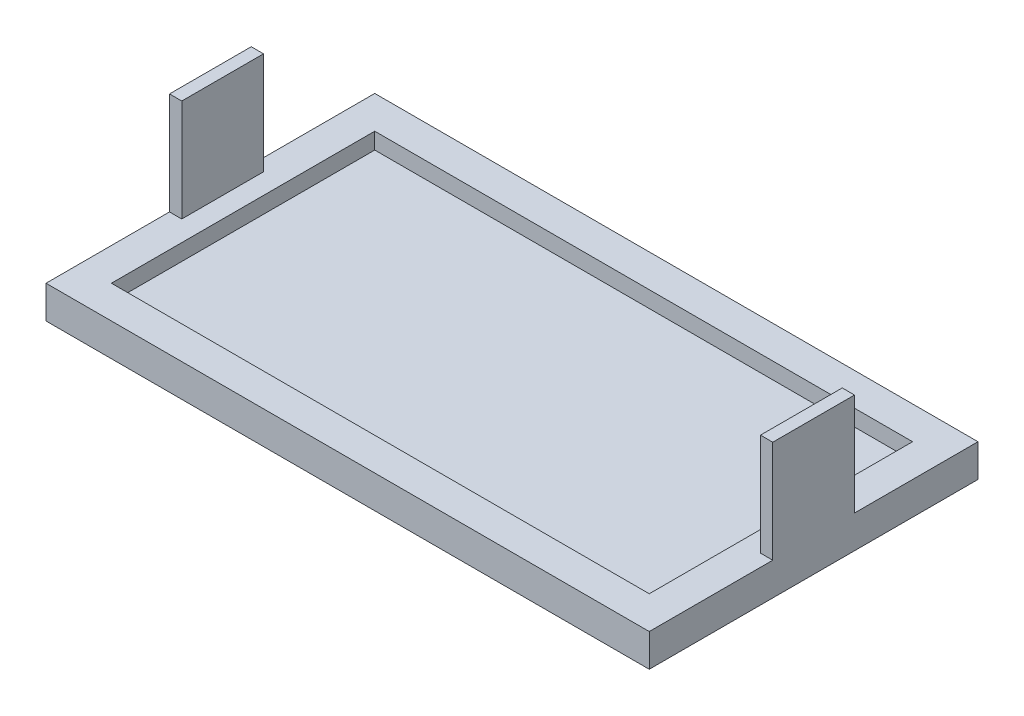
ISO-10303-21;
HEADER;
FILE_DESCRIPTION(('STEP AP214'),'2;1');
FILE_NAME('part.step','',(''),(''),'','','');
FILE_SCHEMA(('AUTOMOTIVE_DESIGN { 1 0 10303 214 1 1 1 1 }'));
ENDSEC;
DATA;
#1=APPLICATION_CONTEXT('core data for automotive mechanical design processes');
#2=APPLICATION_PROTOCOL_DEFINITION('international standard','automotive_design',2000,#1);
#3=PRODUCT_CONTEXT('',#1,'mechanical');
#4=PRODUCT('Part','Part','',(#3));
#5=PRODUCT_RELATED_PRODUCT_CATEGORY('part','',(#4));
#6=PRODUCT_DEFINITION_FORMATION('','',#4);
#7=PRODUCT_DEFINITION_CONTEXT('part definition',#1,'design');
#8=PRODUCT_DEFINITION('design','',#6,#7);
#9=PRODUCT_DEFINITION_SHAPE('','',#8);
#10=(LENGTH_UNIT() NAMED_UNIT(*) SI_UNIT(.MILLI.,.METRE.));
#11=(NAMED_UNIT(*) PLANE_ANGLE_UNIT() SI_UNIT($,.RADIAN.));
#12=(NAMED_UNIT(*) SI_UNIT($,.STERADIAN.) SOLID_ANGLE_UNIT());
#13=UNCERTAINTY_MEASURE_WITH_UNIT(LENGTH_MEASURE(1.E-05),#10,'distance_accuracy_value','');
#14=(GEOMETRIC_REPRESENTATION_CONTEXT(3) GLOBAL_UNCERTAINTY_ASSIGNED_CONTEXT((#13)) GLOBAL_UNIT_ASSIGNED_CONTEXT((#10,
#11,#12)) REPRESENTATION_CONTEXT('',''));
#15=CARTESIAN_POINT('',(0.,0.,0.));
#16=DIRECTION('',(0.,0.,1.));
#17=DIRECTION('',(1.,0.,0.));
#18=AXIS2_PLACEMENT_3D('',#15,#16,#17);
#19=CARTESIAN_POINT('',(0.,8.,0.));
#20=DIRECTION('',(0.,-1.,0.));
#21=DIRECTION('',(0.,0.,-1.));
#22=AXIS2_PLACEMENT_3D('',#19,#20,#21);
#23=PLANE('',#22);
#24=DIRECTION('',(1.,0.,0.));
#25=VECTOR('',#24,1.);
#26=CARTESIAN_POINT('',(8.00000000000001,8.,-8.));
#27=LINE('',#26,#25);
#28=CARTESIAN_POINT('',(8.00000000000001,8.,-8.));
#29=VERTEX_POINT('',#28);
#30=CARTESIAN_POINT('',(139.57,8.,-8.));
#31=VERTEX_POINT('',#30);
#32=EDGE_CURVE('E262',#29,#31,#27,.T.);
#33=ORIENTED_EDGE('',*,*,#32,.F.);
#34=DIRECTION('',(0.,0.,1.));
#35=VECTOR('',#34,1.);
#36=CARTESIAN_POINT('',(8.,8.,-72.42));
#37=LINE('',#36,#35);
#38=CARTESIAN_POINT('',(8.,8.,-72.42));
#39=VERTEX_POINT('',#38);
#40=EDGE_CURVE('E241',#39,#29,#37,.T.);
#41=ORIENTED_EDGE('',*,*,#40,.F.);
#42=DIRECTION('',(-1.,0.,0.));
#43=VECTOR('',#42,1.);
#44=CARTESIAN_POINT('',(8.,8.,-72.42));
#45=LINE('',#44,#43);
#46=CARTESIAN_POINT('',(139.57,8.,-72.42));
#47=VERTEX_POINT('',#46);
#48=EDGE_CURVE('E247',#47,#39,#45,.T.);
#49=ORIENTED_EDGE('',*,*,#48,.F.);
#50=DIRECTION('',(0.,0.,-1.));
#51=VECTOR('',#50,1.);
#52=CARTESIAN_POINT('',(139.57,8.,-72.42));
#53=LINE('',#52,#51);
#54=EDGE_CURVE('E266',#31,#47,#53,.T.);
#55=ORIENTED_EDGE('',*,*,#54,.F.);
#56=EDGE_LOOP('',(#33,#41,#49,#55));
#57=FACE_BOUND('',#56,.T.);
#58=DIRECTION('',(0.,0.,-1.));
#59=VECTOR('',#58,1.);
#60=CARTESIAN_POINT('',(144.57,8.,-50.21));
#61=LINE('',#60,#59);
#62=CARTESIAN_POINT('',(144.57,8.,-30.21));
#63=VERTEX_POINT('',#62);
#64=CARTESIAN_POINT('',(144.57,8.,-50.21));
#65=VERTEX_POINT('',#64);
#66=EDGE_CURVE('E54',#63,#65,#61,.T.);
#67=ORIENTED_EDGE('',*,*,#66,.T.);
#68=DIRECTION('',(1.,0.,0.));
#69=VECTOR('',#68,1.);
#70=CARTESIAN_POINT('',(147.57,8.,-50.21));
#71=LINE('',#70,#69);
#72=CARTESIAN_POINT('',(147.57,8.,-50.21));
#73=VERTEX_POINT('',#72);
#74=EDGE_CURVE('E187',#65,#73,#71,.T.);
#75=ORIENTED_EDGE('',*,*,#74,.T.);
#76=DIRECTION('',(0.,0.,-1.));
#77=VECTOR('',#76,1.);
#78=CARTESIAN_POINT('',(147.57,8.,0.));
#79=LINE('',#78,#77);
#80=CARTESIAN_POINT('',(147.57,8.,-80.42));
#81=VERTEX_POINT('',#80);
#82=EDGE_CURVE('E159',#73,#81,#79,.T.);
#83=ORIENTED_EDGE('',*,*,#82,.T.);
#84=DIRECTION('',(-1.,0.,0.));
#85=VECTOR('',#84,1.);
#86=CARTESIAN_POINT('',(0.,8.,-80.42));
#87=LINE('',#86,#85);
#88=CARTESIAN_POINT('',(0.,8.,-80.42));
#89=VERTEX_POINT('',#88);
#90=EDGE_CURVE('E296',#81,#89,#87,.T.);
#91=ORIENTED_EDGE('',*,*,#90,.T.);
#92=DIRECTION('',(0.,0.,1.));
#93=VECTOR('',#92,1.);
#94=CARTESIAN_POINT('',(0.,8.,0.));
#95=LINE('',#94,#93);
#96=CARTESIAN_POINT('',(0.,8.,-50.21));
#97=VERTEX_POINT('',#96);
#98=EDGE_CURVE('E286',#89,#97,#95,.T.);
#99=ORIENTED_EDGE('',*,*,#98,.T.);
#100=DIRECTION('',(-1.,0.,0.));
#101=VECTOR('',#100,1.);
#102=CARTESIAN_POINT('',(0.,8.,-50.21));
#103=LINE('',#102,#101);
#104=CARTESIAN_POINT('',(3.,8.,-50.21));
#105=VERTEX_POINT('',#104);
#106=EDGE_CURVE('E206',#105,#97,#103,.T.);
#107=ORIENTED_EDGE('',*,*,#106,.F.);
#108=DIRECTION('',(0.,0.,-1.));
#109=VECTOR('',#108,1.);
#110=CARTESIAN_POINT('',(3.,8.,-50.21));
#111=LINE('',#110,#109);
#112=CARTESIAN_POINT('',(3.,8.,-30.21));
#113=VERTEX_POINT('',#112);
#114=EDGE_CURVE('E219',#113,#105,#111,.T.);
#115=ORIENTED_EDGE('',*,*,#114,.F.);
#116=DIRECTION('',(1.,0.,0.));
#117=VECTOR('',#116,1.);
#118=CARTESIAN_POINT('',(0.,8.,-30.21));
#119=LINE('',#118,#117);
#120=CARTESIAN_POINT('',(0.,8.,-30.21));
#121=VERTEX_POINT('',#120);
#122=EDGE_CURVE('E164',#121,#113,#119,.T.);
#123=ORIENTED_EDGE('',*,*,#122,.F.);
#124=CARTESIAN_POINT('',(0.,8.,0.));
#125=VERTEX_POINT('',#124);
#126=EDGE_CURVE('E290',#121,#125,#95,.T.);
#127=ORIENTED_EDGE('',*,*,#126,.T.);
#128=DIRECTION('',(1.,0.,0.));
#129=VECTOR('',#128,1.);
#130=CARTESIAN_POINT('',(0.,8.,0.));
#131=LINE('',#130,#129);
#132=CARTESIAN_POINT('',(147.57,8.,0.));
#133=VERTEX_POINT('',#132);
#134=EDGE_CURVE('E289',#125,#133,#131,.T.);
#135=ORIENTED_EDGE('',*,*,#134,.T.);
#136=CARTESIAN_POINT('',(147.57,8.,-30.21));
#137=VERTEX_POINT('',#136);
#138=EDGE_CURVE('E293',#133,#137,#79,.T.);
#139=ORIENTED_EDGE('',*,*,#138,.T.);
#140=DIRECTION('',(-1.,0.,0.));
#141=VECTOR('',#140,1.);
#142=CARTESIAN_POINT('',(147.57,8.,-30.21));
#143=LINE('',#142,#141);
#144=EDGE_CURVE('E59',#137,#63,#143,.T.);
#145=ORIENTED_EDGE('',*,*,#144,.T.);
#146=EDGE_LOOP('',(#67,#75,#83,#91,#99,#107,#115,#123,#127,#135,#139,#145));
#147=FACE_BOUND('',#146,.T.);
#148=ADVANCED_FACE('F38',(#57,#147),#23,.F.);
#149=CARTESIAN_POINT('',(0.,8.,0.));
#150=DIRECTION('',(1.,0.,0.));
#151=DIRECTION('',(0.,0.,-1.));
#152=AXIS2_PLACEMENT_3D('',#149,#150,#151);
#153=PLANE('',#152);
#154=DIRECTION('',(0.,0.,1.));
#155=VECTOR('',#154,1.);
#156=CARTESIAN_POINT('',(0.,0.,0.));
#157=LINE('',#156,#155);
#158=CARTESIAN_POINT('',(0.,0.,-80.42));
#159=VERTEX_POINT('',#158);
#160=CARTESIAN_POINT('',(0.,0.,0.));
#161=VERTEX_POINT('',#160);
#162=EDGE_CURVE('E276',#159,#161,#157,.T.);
#163=ORIENTED_EDGE('',*,*,#162,.T.);
#164=DIRECTION('',(0.,-1.,0.));
#165=VECTOR('',#164,1.);
#166=CARTESIAN_POINT('',(0.,8.,0.));
#167=LINE('',#166,#165);
#168=EDGE_CURVE('E11',#125,#161,#167,.T.);
#169=ORIENTED_EDGE('',*,*,#168,.F.);
#170=ORIENTED_EDGE('',*,*,#126,.F.);
#171=DIRECTION('',(0.,-1.,0.));
#172=VECTOR('',#171,1.);
#173=CARTESIAN_POINT('',(0.,33.,-30.21));
#174=LINE('',#173,#172);
#175=CARTESIAN_POINT('',(0.,33.,-30.21));
#176=VERTEX_POINT('',#175);
#177=EDGE_CURVE('E237',#176,#121,#174,.T.);
#178=ORIENTED_EDGE('',*,*,#177,.F.);
#179=DIRECTION('',(0.,0.,1.));
#180=VECTOR('',#179,1.);
#181=CARTESIAN_POINT('',(0.,33.,-50.21));
#182=LINE('',#181,#180);
#183=CARTESIAN_POINT('',(0.,33.,-50.21));
#184=VERTEX_POINT('',#183);
#185=EDGE_CURVE('E201',#184,#176,#182,.T.);
#186=ORIENTED_EDGE('',*,*,#185,.F.);
#187=DIRECTION('',(0.,-1.,0.));
#188=VECTOR('',#187,1.);
#189=CARTESIAN_POINT('',(0.,33.,-50.21));
#190=LINE('',#189,#188);
#191=EDGE_CURVE('E215',#184,#97,#190,.T.);
#192=ORIENTED_EDGE('',*,*,#191,.T.);
#193=ORIENTED_EDGE('',*,*,#98,.F.);
#194=DIRECTION('',(0.,-1.,0.));
#195=VECTOR('',#194,1.);
#196=CARTESIAN_POINT('',(0.,8.,-80.42));
#197=LINE('',#196,#195);
#198=EDGE_CURVE('E299',#89,#159,#197,.T.);
#199=ORIENTED_EDGE('',*,*,#198,.T.);
#200=EDGE_LOOP('',(#163,#169,#170,#178,#186,#192,#193,#199));
#201=FACE_BOUND('',#200,.T.);
#202=ADVANCED_FACE('F40',(#201),#153,.F.);
#203=CARTESIAN_POINT('',(0.,8.,0.));
#204=DIRECTION('',(0.,0.,-1.));
#205=DIRECTION('',(-1.,0.,0.));
#206=AXIS2_PLACEMENT_3D('',#203,#204,#205);
#207=PLANE('',#206);
#208=DIRECTION('',(1.,0.,0.));
#209=VECTOR('',#208,1.);
#210=CARTESIAN_POINT('',(0.,0.,0.));
#211=LINE('',#210,#209);
#212=CARTESIAN_POINT('',(147.57,0.,0.));
#213=VERTEX_POINT('',#212);
#214=EDGE_CURVE('E303',#161,#213,#211,.T.);
#215=ORIENTED_EDGE('',*,*,#214,.T.);
#216=DIRECTION('',(0.,-1.,0.));
#217=VECTOR('',#216,1.);
#218=CARTESIAN_POINT('',(147.57,8.,0.));
#219=LINE('',#218,#217);
#220=EDGE_CURVE('E47',#133,#213,#219,.T.);
#221=ORIENTED_EDGE('',*,*,#220,.F.);
#222=ORIENTED_EDGE('',*,*,#134,.F.);
#223=ORIENTED_EDGE('',*,*,#168,.T.);
#224=EDGE_LOOP('',(#215,#221,#222,#223));
#225=FACE_BOUND('',#224,.T.);
#226=ADVANCED_FACE('F352',(#225),#207,.F.);
#227=CARTESIAN_POINT('',(147.57,8.,0.));
#228=DIRECTION('',(-1.,0.,0.));
#229=DIRECTION('',(0.,0.,1.));
#230=AXIS2_PLACEMENT_3D('',#227,#228,#229);
#231=PLANE('',#230);
#232=DIRECTION('',(0.,0.,-1.));
#233=VECTOR('',#232,1.);
#234=CARTESIAN_POINT('',(147.57,0.,0.));
#235=LINE('',#234,#233);
#236=CARTESIAN_POINT('',(147.57,0.,-80.42));
#237=VERTEX_POINT('',#236);
#238=EDGE_CURVE('E306',#213,#237,#235,.T.);
#239=ORIENTED_EDGE('',*,*,#238,.T.);
#240=DIRECTION('',(0.,-1.,0.));
#241=VECTOR('',#240,1.);
#242=CARTESIAN_POINT('',(147.57,8.,-80.42));
#243=LINE('',#242,#241);
#244=EDGE_CURVE('E315',#81,#237,#243,.T.);
#245=ORIENTED_EDGE('',*,*,#244,.F.);
#246=ORIENTED_EDGE('',*,*,#82,.F.);
#247=DIRECTION('',(0.,-1.,0.));
#248=VECTOR('',#247,1.);
#249=CARTESIAN_POINT('',(147.57,33.,-50.21));
#250=LINE('',#249,#248);
#251=CARTESIAN_POINT('',(147.57,33.,-50.21));
#252=VERTEX_POINT('',#251);
#253=EDGE_CURVE('E152',#252,#73,#250,.T.);
#254=ORIENTED_EDGE('',*,*,#253,.F.);
#255=DIRECTION('',(0.,0.,1.));
#256=VECTOR('',#255,1.);
#257=CARTESIAN_POINT('',(147.57,33.,-50.21));
#258=LINE('',#257,#256);
#259=CARTESIAN_POINT('',(147.57,33.,-30.21));
#260=VERTEX_POINT('',#259);
#261=EDGE_CURVE('E156',#252,#260,#258,.T.);
#262=ORIENTED_EDGE('',*,*,#261,.T.);
#263=DIRECTION('',(0.,-1.,0.));
#264=VECTOR('',#263,1.);
#265=CARTESIAN_POINT('',(147.57,33.,-30.21));
#266=LINE('',#265,#264);
#267=EDGE_CURVE('E186',#260,#137,#266,.T.);
#268=ORIENTED_EDGE('',*,*,#267,.T.);
#269=ORIENTED_EDGE('',*,*,#138,.F.);
#270=ORIENTED_EDGE('',*,*,#220,.T.);
#271=EDGE_LOOP('',(#239,#245,#246,#254,#262,#268,#269,#270));
#272=FACE_BOUND('',#271,.T.);
#273=ADVANCED_FACE('F154',(#272),#231,.F.);
#274=CARTESIAN_POINT('',(0.,8.,-80.42));
#275=DIRECTION('',(0.,0.,1.));
#276=DIRECTION('',(1.,0.,0.));
#277=AXIS2_PLACEMENT_3D('',#274,#275,#276);
#278=PLANE('',#277);
#279=DIRECTION('',(-1.,0.,0.));
#280=VECTOR('',#279,1.);
#281=CARTESIAN_POINT('',(0.,0.,-80.42));
#282=LINE('',#281,#280);
#283=EDGE_CURVE('E309',#237,#159,#282,.T.);
#284=ORIENTED_EDGE('',*,*,#283,.T.);
#285=ORIENTED_EDGE('',*,*,#198,.F.);
#286=ORIENTED_EDGE('',*,*,#90,.F.);
#287=ORIENTED_EDGE('',*,*,#244,.T.);
#288=EDGE_LOOP('',(#284,#285,#286,#287));
#289=FACE_BOUND('',#288,.T.);
#290=ADVANCED_FACE('F331',(#289),#278,.F.);
#291=CARTESIAN_POINT('',(0.,0.,0.));
#292=DIRECTION('',(0.,-1.,0.));
#293=DIRECTION('',(0.,0.,-1.));
#294=AXIS2_PLACEMENT_3D('',#291,#292,#293);
#295=PLANE('',#294);
#296=ORIENTED_EDGE('',*,*,#162,.F.);
#297=ORIENTED_EDGE('',*,*,#283,.F.);
#298=ORIENTED_EDGE('',*,*,#238,.F.);
#299=ORIENTED_EDGE('',*,*,#214,.F.);
#300=EDGE_LOOP('',(#296,#297,#298,#299));
#301=FACE_BOUND('',#300,.T.);
#302=ADVANCED_FACE('F328',(#301),#295,.T.);
#303=CARTESIAN_POINT('',(8.,4.,-72.42));
#304=DIRECTION('',(-1.,0.,0.));
#305=DIRECTION('',(0.,0.,1.));
#306=AXIS2_PLACEMENT_3D('',#303,#304,#305);
#307=PLANE('',#306);
#308=ORIENTED_EDGE('',*,*,#40,.T.);
#309=DIRECTION('',(0.,1.,0.));
#310=VECTOR('',#309,1.);
#311=CARTESIAN_POINT('',(8.00000000000001,4.,-8.));
#312=LINE('',#311,#310);
#313=CARTESIAN_POINT('',(8.00000000000001,4.,-8.));
#314=VERTEX_POINT('',#313);
#315=EDGE_CURVE('E259',#314,#29,#312,.T.);
#316=ORIENTED_EDGE('',*,*,#315,.F.);
#317=DIRECTION('',(0.,0.,1.));
#318=VECTOR('',#317,1.);
#319=CARTESIAN_POINT('',(8.,4.,-72.42));
#320=LINE('',#319,#318);
#321=CARTESIAN_POINT('',(8.,4.,-72.42));
#322=VERTEX_POINT('',#321);
#323=EDGE_CURVE('E242',#322,#314,#320,.T.);
#324=ORIENTED_EDGE('',*,*,#323,.F.);
#325=DIRECTION('',(0.,1.,0.));
#326=VECTOR('',#325,1.);
#327=CARTESIAN_POINT('',(8.,4.,-72.42));
#328=LINE('',#327,#326);
#329=EDGE_CURVE('E273',#322,#39,#328,.T.);
#330=ORIENTED_EDGE('',*,*,#329,.T.);
#331=EDGE_LOOP('',(#308,#316,#324,#330));
#332=FACE_BOUND('',#331,.T.);
#333=ADVANCED_FACE('F370',(#332),#307,.F.);
#334=CARTESIAN_POINT('',(8.,4.,-72.42));
#335=DIRECTION('',(0.,0.,-1.));
#336=DIRECTION('',(-1.,0.,0.));
#337=AXIS2_PLACEMENT_3D('',#334,#335,#336);
#338=PLANE('',#337);
#339=ORIENTED_EDGE('',*,*,#48,.T.);
#340=ORIENTED_EDGE('',*,*,#329,.F.);
#341=DIRECTION('',(-1.,0.,0.));
#342=VECTOR('',#341,1.);
#343=CARTESIAN_POINT('',(8.,4.,-72.42));
#344=LINE('',#343,#342);
#345=CARTESIAN_POINT('',(139.57,4.,-72.42));
#346=VERTEX_POINT('',#345);
#347=EDGE_CURVE('E255',#346,#322,#344,.T.);
#348=ORIENTED_EDGE('',*,*,#347,.F.);
#349=DIRECTION('',(0.,1.,0.));
#350=VECTOR('',#349,1.);
#351=CARTESIAN_POINT('',(139.57,4.,-72.42));
#352=LINE('',#351,#350);
#353=EDGE_CURVE('E277',#346,#47,#352,.T.);
#354=ORIENTED_EDGE('',*,*,#353,.T.);
#355=EDGE_LOOP('',(#339,#340,#348,#354));
#356=FACE_BOUND('',#355,.T.);
#357=ADVANCED_FACE('F386',(#356),#338,.F.);
#358=CARTESIAN_POINT('',(139.57,4.,-72.42));
#359=DIRECTION('',(1.,0.,0.));
#360=DIRECTION('',(0.,0.,-1.));
#361=AXIS2_PLACEMENT_3D('',#358,#359,#360);
#362=PLANE('',#361);
#363=ORIENTED_EDGE('',*,*,#54,.T.);
#364=ORIENTED_EDGE('',*,*,#353,.F.);
#365=DIRECTION('',(0.,0.,-1.));
#366=VECTOR('',#365,1.);
#367=CARTESIAN_POINT('',(139.57,4.,-72.42));
#368=LINE('',#367,#366);
#369=CARTESIAN_POINT('',(139.57,4.,-8.));
#370=VERTEX_POINT('',#369);
#371=EDGE_CURVE('E251',#370,#346,#368,.T.);
#372=ORIENTED_EDGE('',*,*,#371,.F.);
#373=DIRECTION('',(0.,1.,0.));
#374=VECTOR('',#373,1.);
#375=CARTESIAN_POINT('',(139.57,4.,-8.));
#376=LINE('',#375,#374);
#377=EDGE_CURVE('E280',#370,#31,#376,.T.);
#378=ORIENTED_EDGE('',*,*,#377,.T.);
#379=EDGE_LOOP('',(#363,#364,#372,#378));
#380=FACE_BOUND('',#379,.T.);
#381=ADVANCED_FACE('F393',(#380),#362,.F.);
#382=CARTESIAN_POINT('',(8.00000000000001,4.,-8.));
#383=DIRECTION('',(0.,0.,1.));
#384=DIRECTION('',(1.,0.,0.));
#385=AXIS2_PLACEMENT_3D('',#382,#383,#384);
#386=PLANE('',#385);
#387=ORIENTED_EDGE('',*,*,#32,.T.);
#388=ORIENTED_EDGE('',*,*,#377,.F.);
#389=DIRECTION('',(1.,0.,0.));
#390=VECTOR('',#389,1.);
#391=CARTESIAN_POINT('',(8.00000000000001,4.,-8.));
#392=LINE('',#391,#390);
#393=EDGE_CURVE('E246',#314,#370,#392,.T.);
#394=ORIENTED_EDGE('',*,*,#393,.F.);
#395=ORIENTED_EDGE('',*,*,#315,.T.);
#396=EDGE_LOOP('',(#387,#388,#394,#395));
#397=FACE_BOUND('',#396,.T.);
#398=ADVANCED_FACE('F401',(#397),#386,.F.);
#399=CARTESIAN_POINT('',(0.,4.,0.));
#400=DIRECTION('',(0.,1.,0.));
#401=DIRECTION('',(0.,0.,1.));
#402=AXIS2_PLACEMENT_3D('',#399,#400,#401);
#403=PLANE('',#402);
#404=ORIENTED_EDGE('',*,*,#323,.T.);
#405=ORIENTED_EDGE('',*,*,#393,.T.);
#406=ORIENTED_EDGE('',*,*,#371,.T.);
#407=ORIENTED_EDGE('',*,*,#347,.T.);
#408=EDGE_LOOP('',(#404,#405,#406,#407));
#409=FACE_BOUND('',#408,.T.);
#410=ADVANCED_FACE('F409',(#409),#403,.T.);
#411=CARTESIAN_POINT('',(0.,33.,-30.21));
#412=DIRECTION('',(0.,0.,-1.));
#413=DIRECTION('',(-1.,0.,0.));
#414=AXIS2_PLACEMENT_3D('',#411,#412,#413);
#415=PLANE('',#414);
#416=ORIENTED_EDGE('',*,*,#122,.T.);
#417=DIRECTION('',(0.,-1.,0.));
#418=VECTOR('',#417,1.);
#419=CARTESIAN_POINT('',(3.,33.,-30.21));
#420=LINE('',#419,#418);
#421=CARTESIAN_POINT('',(3.,33.,-30.21));
#422=VERTEX_POINT('',#421);
#423=EDGE_CURVE('E233',#422,#113,#420,.T.);
#424=ORIENTED_EDGE('',*,*,#423,.F.);
#425=DIRECTION('',(1.,0.,0.));
#426=VECTOR('',#425,1.);
#427=CARTESIAN_POINT('',(0.,33.,-30.21));
#428=LINE('',#427,#426);
#429=EDGE_CURVE('E205',#176,#422,#428,.T.);
#430=ORIENTED_EDGE('',*,*,#429,.F.);
#431=ORIENTED_EDGE('',*,*,#177,.T.);
#432=EDGE_LOOP('',(#416,#424,#430,#431));
#433=FACE_BOUND('',#432,.T.);
#434=ADVANCED_FACE('F348',(#433),#415,.F.);
#435=CARTESIAN_POINT('',(3.,33.,-50.21));
#436=DIRECTION('',(-1.,0.,0.));
#437=DIRECTION('',(0.,0.,1.));
#438=AXIS2_PLACEMENT_3D('',#435,#436,#437);
#439=PLANE('',#438);
#440=ORIENTED_EDGE('',*,*,#114,.T.);
#441=DIRECTION('',(0.,-1.,0.));
#442=VECTOR('',#441,1.);
#443=CARTESIAN_POINT('',(3.,33.,-50.21));
#444=LINE('',#443,#442);
#445=CARTESIAN_POINT('',(3.,33.,-50.21));
#446=VERTEX_POINT('',#445);
#447=EDGE_CURVE('E229',#446,#105,#444,.T.);
#448=ORIENTED_EDGE('',*,*,#447,.F.);
#449=DIRECTION('',(0.,0.,-1.));
#450=VECTOR('',#449,1.);
#451=CARTESIAN_POINT('',(3.,33.,-50.21));
#452=LINE('',#451,#450);
#453=EDGE_CURVE('E209',#422,#446,#452,.T.);
#454=ORIENTED_EDGE('',*,*,#453,.F.);
#455=ORIENTED_EDGE('',*,*,#423,.T.);
#456=EDGE_LOOP('',(#440,#448,#454,#455));
#457=FACE_BOUND('',#456,.T.);
#458=ADVANCED_FACE('F344',(#457),#439,.F.);
#459=CARTESIAN_POINT('',(0.,33.,-50.21));
#460=DIRECTION('',(0.,0.,1.));
#461=DIRECTION('',(1.,0.,0.));
#462=AXIS2_PLACEMENT_3D('',#459,#460,#461);
#463=PLANE('',#462);
#464=ORIENTED_EDGE('',*,*,#106,.T.);
#465=ORIENTED_EDGE('',*,*,#191,.F.);
#466=DIRECTION('',(-1.,0.,0.));
#467=VECTOR('',#466,1.);
#468=CARTESIAN_POINT('',(0.,33.,-50.21));
#469=LINE('',#468,#467);
#470=EDGE_CURVE('E212',#446,#184,#469,.T.);
#471=ORIENTED_EDGE('',*,*,#470,.F.);
#472=ORIENTED_EDGE('',*,*,#447,.T.);
#473=EDGE_LOOP('',(#464,#465,#471,#472));
#474=FACE_BOUND('',#473,.T.);
#475=ADVANCED_FACE('F339',(#474),#463,.F.);
#476=CARTESIAN_POINT('',(0.,33.,0.));
#477=DIRECTION('',(0.,1.,0.));
#478=DIRECTION('',(0.,0.,1.));
#479=AXIS2_PLACEMENT_3D('',#476,#477,#478);
#480=PLANE('',#479);
#481=ORIENTED_EDGE('',*,*,#185,.T.);
#482=ORIENTED_EDGE('',*,*,#429,.T.);
#483=ORIENTED_EDGE('',*,*,#453,.T.);
#484=ORIENTED_EDGE('',*,*,#470,.T.);
#485=EDGE_LOOP('',(#481,#482,#483,#484));
#486=FACE_BOUND('',#485,.T.);
#487=ADVANCED_FACE('F447',(#486),#480,.T.);
#488=CARTESIAN_POINT('',(147.57,33.,-50.21));
#489=DIRECTION('',(0.,0.,-1.));
#490=DIRECTION('',(-1.,0.,0.));
#491=AXIS2_PLACEMENT_3D('',#488,#489,#490);
#492=PLANE('',#491);
#493=ORIENTED_EDGE('',*,*,#74,.F.);
#494=DIRECTION('',(0.,-1.,0.));
#495=VECTOR('',#494,1.);
#496=CARTESIAN_POINT('',(144.57,33.,-50.21));
#497=LINE('',#496,#495);
#498=CARTESIAN_POINT('',(144.57,33.,-50.21));
#499=VERTEX_POINT('',#498);
#500=EDGE_CURVE('E165',#499,#65,#497,.T.);
#501=ORIENTED_EDGE('',*,*,#500,.F.);
#502=DIRECTION('',(1.,0.,0.));
#503=VECTOR('',#502,1.);
#504=CARTESIAN_POINT('',(147.57,33.,-50.21));
#505=LINE('',#504,#503);
#506=EDGE_CURVE('E171',#499,#252,#505,.T.);
#507=ORIENTED_EDGE('',*,*,#506,.T.);
#508=ORIENTED_EDGE('',*,*,#253,.T.);
#509=EDGE_LOOP('',(#493,#501,#507,#508));
#510=FACE_BOUND('',#509,.T.);
#511=ADVANCED_FACE('F177',(#510),#492,.T.);
#512=CARTESIAN_POINT('',(144.57,33.,-50.21));
#513=DIRECTION('',(-1.,0.,0.));
#514=DIRECTION('',(0.,0.,1.));
#515=AXIS2_PLACEMENT_3D('',#512,#513,#514);
#516=PLANE('',#515);
#517=ORIENTED_EDGE('',*,*,#66,.F.);
#518=DIRECTION('',(0.,-1.,0.));
#519=VECTOR('',#518,1.);
#520=CARTESIAN_POINT('',(144.57,33.,-30.21));
#521=LINE('',#520,#519);
#522=CARTESIAN_POINT('',(144.57,33.,-30.21));
#523=VERTEX_POINT('',#522);
#524=EDGE_CURVE('E196',#523,#63,#521,.T.);
#525=ORIENTED_EDGE('',*,*,#524,.F.);
#526=DIRECTION('',(0.,0.,-1.));
#527=VECTOR('',#526,1.);
#528=CARTESIAN_POINT('',(144.57,33.,-50.21));
#529=LINE('',#528,#527);
#530=EDGE_CURVE('E179',#523,#499,#529,.T.);
#531=ORIENTED_EDGE('',*,*,#530,.T.);
#532=ORIENTED_EDGE('',*,*,#500,.T.);
#533=EDGE_LOOP('',(#517,#525,#531,#532));
#534=FACE_BOUND('',#533,.T.);
#535=ADVANCED_FACE('F459',(#534),#516,.T.);
#536=CARTESIAN_POINT('',(147.57,33.,-30.21));
#537=DIRECTION('',(0.,0.,1.));
#538=DIRECTION('',(1.,0.,0.));
#539=AXIS2_PLACEMENT_3D('',#536,#537,#538);
#540=PLANE('',#539);
#541=ORIENTED_EDGE('',*,*,#144,.F.);
#542=ORIENTED_EDGE('',*,*,#267,.F.);
#543=DIRECTION('',(-1.,0.,0.));
#544=VECTOR('',#543,1.);
#545=CARTESIAN_POINT('',(147.57,33.,-30.21));
#546=LINE('',#545,#544);
#547=EDGE_CURVE('E174',#260,#523,#546,.T.);
#548=ORIENTED_EDGE('',*,*,#547,.T.);
#549=ORIENTED_EDGE('',*,*,#524,.T.);
#550=EDGE_LOOP('',(#541,#542,#548,#549));
#551=FACE_BOUND('',#550,.T.);
#552=ADVANCED_FACE('F466',(#551),#540,.T.);
#553=CARTESIAN_POINT('',(147.57,33.,0.));
#554=DIRECTION('',(0.,1.,0.));
#555=DIRECTION('',(0.,0.,1.));
#556=AXIS2_PLACEMENT_3D('',#553,#554,#555);
#557=PLANE('',#556);
#558=ORIENTED_EDGE('',*,*,#261,.F.);
#559=ORIENTED_EDGE('',*,*,#506,.F.);
#560=ORIENTED_EDGE('',*,*,#530,.F.);
#561=ORIENTED_EDGE('',*,*,#547,.F.);
#562=EDGE_LOOP('',(#558,#559,#560,#561));
#563=FACE_BOUND('',#562,.T.);
#564=ADVANCED_FACE('F169',(#563),#557,.T.);
#565=CLOSED_SHELL('',(#148,#202,#226,#273,#290,#302,#333,#357,#381,#398,#410,#434,#458,#475,
#487,#511,#535,#552,#564));
#566=MANIFOLD_SOLID_BREP('B2',#565);
#567=ADVANCED_BREP_SHAPE_REPRESENTATION('',(#18,#566),#14);
#568=SHAPE_DEFINITION_REPRESENTATION(#9,#567);
ENDSEC;
END-ISO-10303-21;
